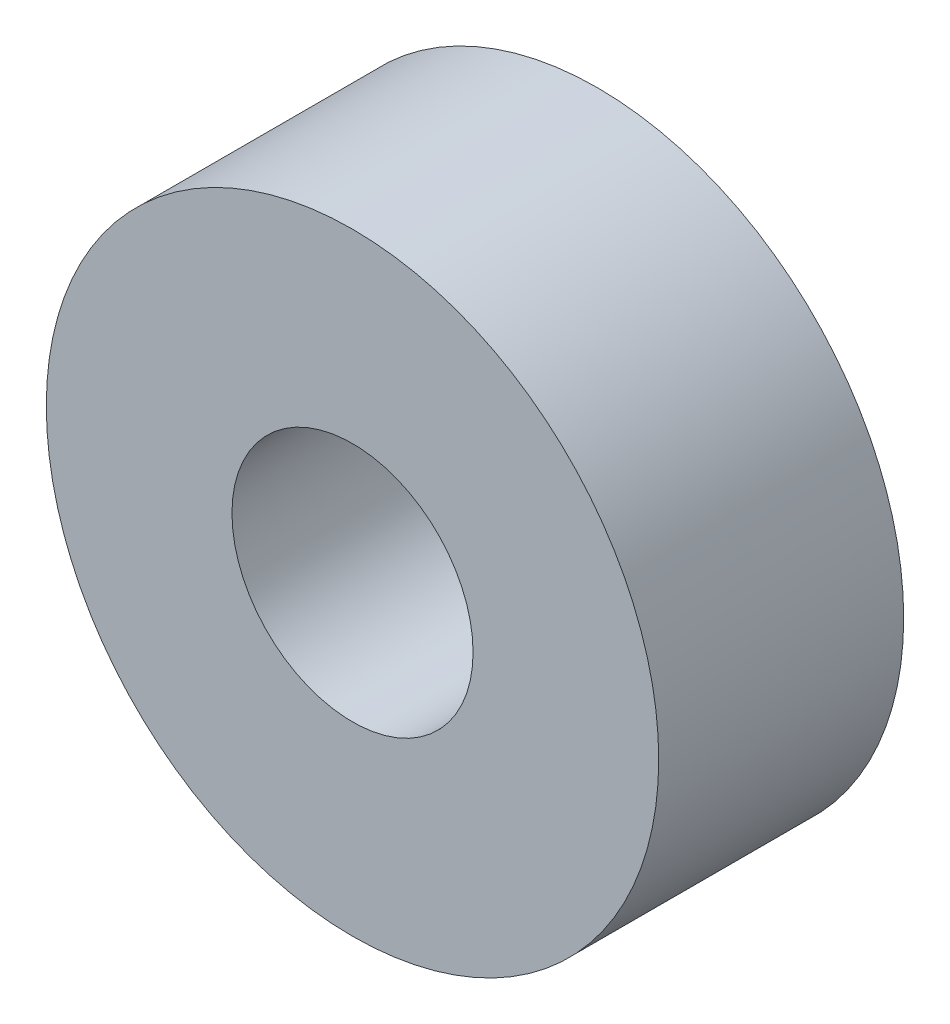
ISO-10303-21;
HEADER;
FILE_DESCRIPTION(('STEP AP214'),'2;1');
FILE_NAME('part.step','',(''),(''),'','','');
FILE_SCHEMA(('AUTOMOTIVE_DESIGN { 1 0 10303 214 1 1 1 1 }'));
ENDSEC;
DATA;
#1=APPLICATION_CONTEXT('core data for automotive mechanical design processes');
#2=APPLICATION_PROTOCOL_DEFINITION('international standard','automotive_design',2000,#1);
#3=PRODUCT_CONTEXT('',#1,'mechanical');
#4=PRODUCT('Part','Part','',(#3));
#5=PRODUCT_RELATED_PRODUCT_CATEGORY('part','',(#4));
#6=PRODUCT_DEFINITION_FORMATION('','',#4);
#7=PRODUCT_DEFINITION_CONTEXT('part definition',#1,'design');
#8=PRODUCT_DEFINITION('design','',#6,#7);
#9=PRODUCT_DEFINITION_SHAPE('','',#8);
#10=(LENGTH_UNIT() NAMED_UNIT(*) SI_UNIT(.MILLI.,.METRE.));
#11=(NAMED_UNIT(*) PLANE_ANGLE_UNIT() SI_UNIT($,.RADIAN.));
#12=(NAMED_UNIT(*) SI_UNIT($,.STERADIAN.) SOLID_ANGLE_UNIT());
#13=UNCERTAINTY_MEASURE_WITH_UNIT(LENGTH_MEASURE(1.E-05),#10,'distance_accuracy_value','');
#14=(GEOMETRIC_REPRESENTATION_CONTEXT(3) GLOBAL_UNCERTAINTY_ASSIGNED_CONTEXT((#13)) GLOBAL_UNIT_ASSIGNED_CONTEXT((#10,
#11,#12)) REPRESENTATION_CONTEXT('',''));
#15=CARTESIAN_POINT('',(0.,0.,0.));
#16=DIRECTION('',(0.,0.,1.));
#17=DIRECTION('',(1.,0.,0.));
#18=AXIS2_PLACEMENT_3D('',#15,#16,#17);
#19=CARTESIAN_POINT('',(0.,0.,5.08));
#20=DIRECTION('',(0.,0.,1.));
#21=DIRECTION('',(1.,0.,0.));
#22=AXIS2_PLACEMENT_3D('',#19,#20,#21);
#23=PLANE('',#22);
#24=CARTESIAN_POINT('',(0.,0.,5.08));
#25=DIRECTION('',(0.,0.,1.));
#26=DIRECTION('',(1.,0.,0.));
#27=AXIS2_PLACEMENT_3D('',#24,#25,#26);
#28=CIRCLE('',#27,12.7);
#29=CARTESIAN_POINT('',(12.7,0.,5.08));
#30=VERTEX_POINT('',#29);
#31=EDGE_CURVE('E10',#30,#30,#28,.T.);
#32=ORIENTED_EDGE('',*,*,#31,.T.);
#33=EDGE_LOOP('',(#32));
#34=FACE_BOUND('',#33,.T.);
#35=CARTESIAN_POINT('',(0.,0.,5.08));
#36=DIRECTION('',(0.,0.,1.));
#37=DIRECTION('',(1.,0.,0.));
#38=AXIS2_PLACEMENT_3D('',#35,#36,#37);
#39=CIRCLE('',#38,5.);
#40=CARTESIAN_POINT('',(5.,0.,5.08));
#41=VERTEX_POINT('',#40);
#42=EDGE_CURVE('E44',#41,#41,#39,.T.);
#43=ORIENTED_EDGE('',*,*,#42,.F.);
#44=EDGE_LOOP('',(#43));
#45=FACE_BOUND('',#44,.T.);
#46=ADVANCED_FACE('F33',(#34,#45),#23,.T.);
#47=CARTESIAN_POINT('',(0.,0.,-5.08));
#48=DIRECTION('',(0.,0.,1.));
#49=DIRECTION('',(1.,0.,0.));
#50=AXIS2_PLACEMENT_3D('',#47,#48,#49);
#51=PLANE('',#50);
#52=CARTESIAN_POINT('',(0.,0.,-5.08));
#53=DIRECTION('',(0.,0.,1.));
#54=DIRECTION('',(1.,0.,0.));
#55=AXIS2_PLACEMENT_3D('',#52,#53,#54);
#56=CIRCLE('',#55,12.7);
#57=CARTESIAN_POINT('',(12.7,0.,-5.08));
#58=VERTEX_POINT('',#57);
#59=EDGE_CURVE('E37',#58,#58,#56,.T.);
#60=ORIENTED_EDGE('',*,*,#59,.F.);
#61=EDGE_LOOP('',(#60));
#62=FACE_BOUND('',#61,.T.);
#63=CARTESIAN_POINT('',(0.,0.,-5.08));
#64=DIRECTION('',(0.,0.,1.));
#65=DIRECTION('',(1.,0.,0.));
#66=AXIS2_PLACEMENT_3D('',#63,#64,#65);
#67=CIRCLE('',#66,5.);
#68=CARTESIAN_POINT('',(5.,0.,-5.08));
#69=VERTEX_POINT('',#68);
#70=EDGE_CURVE('E46',#69,#69,#67,.T.);
#71=ORIENTED_EDGE('',*,*,#70,.T.);
#72=EDGE_LOOP('',(#71));
#73=FACE_BOUND('',#72,.T.);
#74=ADVANCED_FACE('F56',(#62,#73),#51,.F.);
#75=CARTESIAN_POINT('',(0.,0.,5.08));
#76=DIRECTION('',(0.,0.,-1.));
#77=DIRECTION('',(-1.,0.,0.));
#78=AXIS2_PLACEMENT_3D('',#75,#76,#77);
#79=CYLINDRICAL_SURFACE('',#78,12.7);
#80=ORIENTED_EDGE('',*,*,#31,.F.);
#81=EDGE_LOOP('',(#80));
#82=FACE_BOUND('',#81,.T.);
#83=ORIENTED_EDGE('',*,*,#59,.T.);
#84=EDGE_LOOP('',(#83));
#85=FACE_BOUND('',#84,.T.);
#86=ADVANCED_FACE('F35',(#82,#85),#79,.T.);
#87=CARTESIAN_POINT('',(0.,0.,5.08));
#88=DIRECTION('',(0.,0.,-1.));
#89=DIRECTION('',(-1.,0.,0.));
#90=AXIS2_PLACEMENT_3D('',#87,#88,#89);
#91=CYLINDRICAL_SURFACE('',#90,5.);
#92=ORIENTED_EDGE('',*,*,#42,.T.);
#93=EDGE_LOOP('',(#92));
#94=FACE_BOUND('',#93,.T.);
#95=ORIENTED_EDGE('',*,*,#70,.F.);
#96=EDGE_LOOP('',(#95));
#97=FACE_BOUND('',#96,.T.);
#98=ADVANCED_FACE('F52',(#94,#97),#91,.F.);
#99=CLOSED_SHELL('',(#46,#74,#86,#98));
#100=MANIFOLD_SOLID_BREP('B2',#99);
#101=ADVANCED_BREP_SHAPE_REPRESENTATION('',(#18,#100),#14);
#102=SHAPE_DEFINITION_REPRESENTATION(#9,#101);
ENDSEC;
END-ISO-10303-21;
